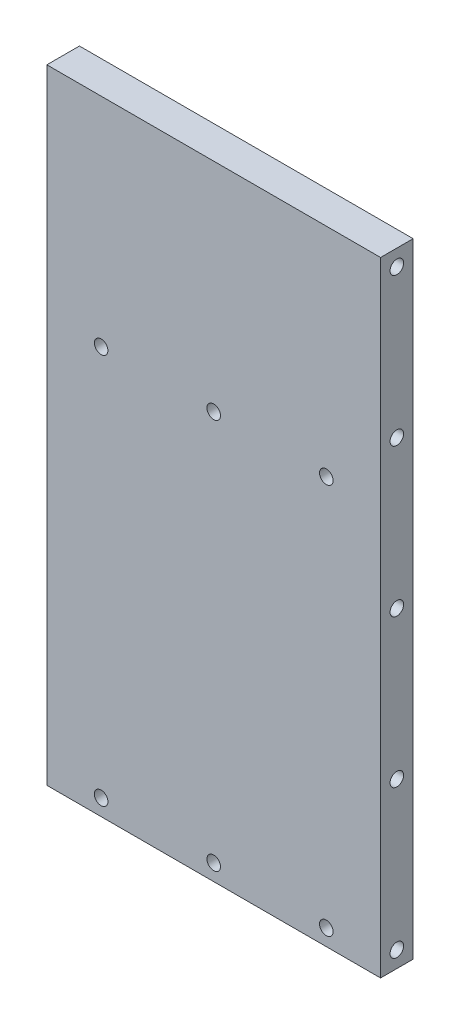
ISO-10303-21;
HEADER;
FILE_DESCRIPTION(('STEP AP214'),'2;1');
FILE_NAME('part.step','',(''),(''),'','','');
FILE_SCHEMA(('AUTOMOTIVE_DESIGN { 1 0 10303 214 1 1 1 1 }'));
ENDSEC;
DATA;
#1=APPLICATION_CONTEXT('core data for automotive mechanical design processes');
#2=APPLICATION_PROTOCOL_DEFINITION('international standard','automotive_design',2000,#1);
#3=PRODUCT_CONTEXT('',#1,'mechanical');
#4=PRODUCT('Part','Part','',(#3));
#5=PRODUCT_RELATED_PRODUCT_CATEGORY('part','',(#4));
#6=PRODUCT_DEFINITION_FORMATION('','',#4);
#7=PRODUCT_DEFINITION_CONTEXT('part definition',#1,'design');
#8=PRODUCT_DEFINITION('design','',#6,#7);
#9=PRODUCT_DEFINITION_SHAPE('','',#8);
#10=(LENGTH_UNIT() NAMED_UNIT(*) SI_UNIT(.MILLI.,.METRE.));
#11=(NAMED_UNIT(*) PLANE_ANGLE_UNIT() SI_UNIT($,.RADIAN.));
#12=(NAMED_UNIT(*) SI_UNIT($,.STERADIAN.) SOLID_ANGLE_UNIT());
#13=UNCERTAINTY_MEASURE_WITH_UNIT(LENGTH_MEASURE(1.E-05),#10,'distance_accuracy_value','');
#14=(GEOMETRIC_REPRESENTATION_CONTEXT(3) GLOBAL_UNCERTAINTY_ASSIGNED_CONTEXT((#13)) GLOBAL_UNIT_ASSIGNED_CONTEXT((#10,
#11,#12)) REPRESENTATION_CONTEXT('',''));
#15=CARTESIAN_POINT('',(0.,0.,0.));
#16=DIRECTION('',(0.,0.,1.));
#17=DIRECTION('',(1.,0.,0.));
#18=AXIS2_PLACEMENT_3D('',#15,#16,#17);
#19=CARTESIAN_POINT('',(-30.75,-54.5,0.));
#20=DIRECTION('',(-1.,0.,0.));
#21=DIRECTION('',(0.,0.,1.));
#22=AXIS2_PLACEMENT_3D('',#19,#20,#21);
#23=CYLINDRICAL_SURFACE('',#22,1.25);
#24=CARTESIAN_POINT('',(0.,-54.5,0.));
#25=DIRECTION('',(-0.707106781186547,0.,-0.707106781186547));
#26=DIRECTION('',(-0.707106781186547,0.,0.707106781186547));
#27=AXIS2_PLACEMENT_3D('',#24,#25,#26);
#28=ELLIPSE('',#27,1.76776695296637,1.25);
#29=CARTESIAN_POINT('',(0.,-53.25,0.));
#30=VERTEX_POINT('',#29);
#31=CARTESIAN_POINT('',(0.,-55.75,0.));
#32=VERTEX_POINT('',#31);
#33=EDGE_CURVE('E110',#30,#32,#28,.T.);
#34=ORIENTED_EDGE('',*,*,#33,.T.);
#35=CARTESIAN_POINT('',(0.,-54.5,0.));
#36=DIRECTION('',(-0.707106781186547,0.,0.707106781186547));
#37=DIRECTION('',(-0.707106781186547,0.,-0.707106781186547));
#38=AXIS2_PLACEMENT_3D('',#35,#36,#37);
#39=ELLIPSE('',#38,1.76776695296637,1.25);
#40=EDGE_CURVE('E107',#32,#30,#39,.T.);
#41=ORIENTED_EDGE('',*,*,#40,.T.);
#42=EDGE_LOOP('',(#34,#41));
#43=FACE_BOUND('',#42,.T.);
#44=CARTESIAN_POINT('',(20.75,-54.5,0.));
#45=DIRECTION('',(-0.707106781186547,0.,-0.707106781186547));
#46=DIRECTION('',(-0.707106781186547,0.,0.707106781186547));
#47=AXIS2_PLACEMENT_3D('',#44,#45,#46);
#48=ELLIPSE('',#47,1.76776695296637,1.25);
#49=CARTESIAN_POINT('',(20.75,-53.25,0.));
#50=VERTEX_POINT('',#49);
#51=CARTESIAN_POINT('',(20.75,-55.75,0.));
#52=VERTEX_POINT('',#51);
#53=EDGE_CURVE('E47',#50,#52,#48,.F.);
#54=ORIENTED_EDGE('',*,*,#53,.T.);
#55=CARTESIAN_POINT('',(20.75,-54.5,0.));
#56=DIRECTION('',(-0.707106781186547,0.,0.707106781186547));
#57=DIRECTION('',(-0.707106781186547,0.,-0.707106781186547));
#58=AXIS2_PLACEMENT_3D('',#55,#56,#57);
#59=ELLIPSE('',#58,1.76776695296637,1.25);
#60=EDGE_CURVE('E11',#52,#50,#59,.F.);
#61=ORIENTED_EDGE('',*,*,#60,.T.);
#62=EDGE_LOOP('',(#54,#61));
#63=FACE_BOUND('',#62,.T.);
#64=ADVANCED_FACE('F34',(#43,#63),#23,.F.);
#65=CARTESIAN_POINT('',(-20.75,-54.5,0.));
#66=DIRECTION('',(-0.707106781186547,0.,-0.707106781186547));
#67=DIRECTION('',(-0.707106781186547,0.,0.707106781186547));
#68=AXIS2_PLACEMENT_3D('',#65,#66,#67);
#69=ELLIPSE('',#68,1.76776695296637,1.25);
#70=CARTESIAN_POINT('',(-20.75,-53.25,0.));
#71=VERTEX_POINT('',#70);
#72=CARTESIAN_POINT('',(-20.75,-55.75,0.));
#73=VERTEX_POINT('',#72);
#74=EDGE_CURVE('E120',#71,#73,#69,.T.);
#75=ORIENTED_EDGE('',*,*,#74,.T.);
#76=CARTESIAN_POINT('',(-20.75,-54.5,0.));
#77=DIRECTION('',(-0.707106781186547,0.,0.707106781186547));
#78=DIRECTION('',(-0.707106781186547,0.,-0.707106781186547));
#79=AXIS2_PLACEMENT_3D('',#76,#77,#78);
#80=ELLIPSE('',#79,1.76776695296637,1.25);
#81=EDGE_CURVE('E117',#73,#71,#80,.T.);
#82=ORIENTED_EDGE('',*,*,#81,.T.);
#83=EDGE_LOOP('',(#75,#82));
#84=FACE_BOUND('',#83,.T.);
#85=CARTESIAN_POINT('',(0.,-54.5,0.));
#86=DIRECTION('',(-0.707106781186547,0.,-0.707106781186547));
#87=DIRECTION('',(-0.707106781186547,0.,0.707106781186547));
#88=AXIS2_PLACEMENT_3D('',#85,#86,#87);
#89=ELLIPSE('',#88,1.76776695296637,1.25);
#90=EDGE_CURVE('E54',#30,#32,#89,.F.);
#91=ORIENTED_EDGE('',*,*,#90,.T.);
#92=CARTESIAN_POINT('',(0.,-54.5,0.));
#93=DIRECTION('',(-0.707106781186547,0.,0.707106781186547));
#94=DIRECTION('',(-0.707106781186547,0.,-0.707106781186547));
#95=AXIS2_PLACEMENT_3D('',#92,#93,#94);
#96=ELLIPSE('',#95,1.76776695296637,1.25);
#97=EDGE_CURVE('E101',#32,#30,#96,.F.);
#98=ORIENTED_EDGE('',*,*,#97,.T.);
#99=EDGE_LOOP('',(#91,#98));
#100=FACE_BOUND('',#99,.T.);
#101=ADVANCED_FACE('F270',(#84,#100),#23,.F.);
#102=CARTESIAN_POINT('',(-30.75,-54.5,0.));
#103=DIRECTION('',(-1.,0.,0.));
#104=DIRECTION('',(0.,0.,1.));
#105=AXIS2_PLACEMENT_3D('',#102,#103,#104);
#106=CIRCLE('',#105,1.25);
#107=CARTESIAN_POINT('',(-30.75,-54.5,1.25));
#108=VERTEX_POINT('',#107);
#109=EDGE_CURVE('E182',#108,#108,#106,.T.);
#110=ORIENTED_EDGE('',*,*,#109,.T.);
#111=EDGE_LOOP('',(#110));
#112=FACE_BOUND('',#111,.T.);
#113=CARTESIAN_POINT('',(-20.75,-54.5,0.));
#114=DIRECTION('',(-0.707106781186547,0.,-0.707106781186547));
#115=DIRECTION('',(-0.707106781186547,0.,0.707106781186547));
#116=AXIS2_PLACEMENT_3D('',#113,#114,#115);
#117=ELLIPSE('',#116,1.76776695296637,1.25);
#118=EDGE_CURVE('E123',#71,#73,#117,.F.);
#119=ORIENTED_EDGE('',*,*,#118,.T.);
#120=CARTESIAN_POINT('',(-20.75,-54.5,0.));
#121=DIRECTION('',(-0.707106781186547,0.,0.707106781186547));
#122=DIRECTION('',(-0.707106781186547,0.,-0.707106781186547));
#123=AXIS2_PLACEMENT_3D('',#120,#121,#122);
#124=ELLIPSE('',#123,1.76776695296637,1.25);
#125=EDGE_CURVE('E114',#73,#71,#124,.F.);
#126=ORIENTED_EDGE('',*,*,#125,.T.);
#127=EDGE_LOOP('',(#119,#126));
#128=FACE_BOUND('',#127,.T.);
#129=ADVANCED_FACE('F276',(#112,#128),#23,.F.);
#130=CARTESIAN_POINT('',(-30.75,57.5,3.));
#131=DIRECTION('',(1.,0.,0.));
#132=DIRECTION('',(0.,0.,-1.));
#133=AXIS2_PLACEMENT_3D('',#130,#131,#132);
#134=PLANE('',#133);
#135=ORIENTED_EDGE('',*,*,#109,.F.);
#136=EDGE_LOOP('',(#135));
#137=FACE_BOUND('',#136,.T.);
#138=CARTESIAN_POINT('',(-30.75,-27.25,0.));
#139=DIRECTION('',(-1.,0.,0.));
#140=DIRECTION('',(0.,0.,1.));
#141=AXIS2_PLACEMENT_3D('',#138,#139,#140);
#142=CIRCLE('',#141,1.25);
#143=CARTESIAN_POINT('',(-30.75,-27.25,1.25));
#144=VERTEX_POINT('',#143);
#145=EDGE_CURVE('E176',#144,#144,#142,.T.);
#146=ORIENTED_EDGE('',*,*,#145,.F.);
#147=EDGE_LOOP('',(#146));
#148=FACE_BOUND('',#147,.T.);
#149=CARTESIAN_POINT('',(-30.75,0.,0.));
#150=DIRECTION('',(-1.,0.,0.));
#151=DIRECTION('',(0.,0.,1.));
#152=AXIS2_PLACEMENT_3D('',#149,#150,#151);
#153=CIRCLE('',#152,1.25);
#154=CARTESIAN_POINT('',(-30.75,0.,1.25));
#155=VERTEX_POINT('',#154);
#156=EDGE_CURVE('E170',#155,#155,#153,.T.);
#157=ORIENTED_EDGE('',*,*,#156,.F.);
#158=EDGE_LOOP('',(#157));
#159=FACE_BOUND('',#158,.T.);
#160=CARTESIAN_POINT('',(-30.75,27.25,0.));
#161=DIRECTION('',(-1.,0.,0.));
#162=DIRECTION('',(0.,0.,1.));
#163=AXIS2_PLACEMENT_3D('',#160,#161,#162);
#164=CIRCLE('',#163,1.25);
#165=CARTESIAN_POINT('',(-30.75,27.25,1.25));
#166=VERTEX_POINT('',#165);
#167=EDGE_CURVE('E164',#166,#166,#164,.T.);
#168=ORIENTED_EDGE('',*,*,#167,.F.);
#169=EDGE_LOOP('',(#168));
#170=FACE_BOUND('',#169,.T.);
#171=CARTESIAN_POINT('',(-30.75,54.5,0.));
#172=DIRECTION('',(-1.,0.,0.));
#173=DIRECTION('',(0.,0.,1.));
#174=AXIS2_PLACEMENT_3D('',#171,#172,#173);
#175=CIRCLE('',#174,1.25);
#176=CARTESIAN_POINT('',(-30.75,54.5,1.25));
#177=VERTEX_POINT('',#176);
#178=EDGE_CURVE('E158',#177,#177,#175,.T.);
#179=ORIENTED_EDGE('',*,*,#178,.F.);
#180=EDGE_LOOP('',(#179));
#181=FACE_BOUND('',#180,.T.);
#182=DIRECTION('',(0.,-1.,0.));
#183=VECTOR('',#182,1.);
#184=CARTESIAN_POINT('',(-30.75,57.5,-3.));
#185=LINE('',#184,#183);
#186=CARTESIAN_POINT('',(-30.75,57.5,-3.));
#187=VERTEX_POINT('',#186);
#188=CARTESIAN_POINT('',(-30.75,-57.5,-3.));
#189=VERTEX_POINT('',#188);
#190=EDGE_CURVE('E145',#187,#189,#185,.T.);
#191=ORIENTED_EDGE('',*,*,#190,.T.);
#192=DIRECTION('',(0.,0.,-1.));
#193=VECTOR('',#192,1.);
#194=CARTESIAN_POINT('',(-30.75,-57.5,3.));
#195=LINE('',#194,#193);
#196=CARTESIAN_POINT('',(-30.75,-57.5,3.));
#197=VERTEX_POINT('',#196);
#198=EDGE_CURVE('E125',#197,#189,#195,.T.);
#199=ORIENTED_EDGE('',*,*,#198,.F.);
#200=DIRECTION('',(0.,-1.,0.));
#201=VECTOR('',#200,1.);
#202=CARTESIAN_POINT('',(-30.75,57.5,3.));
#203=LINE('',#202,#201);
#204=CARTESIAN_POINT('',(-30.75,57.5,3.));
#205=VERTEX_POINT('',#204);
#206=EDGE_CURVE('E140',#205,#197,#203,.T.);
#207=ORIENTED_EDGE('',*,*,#206,.F.);
#208=DIRECTION('',(0.,0.,-1.));
#209=VECTOR('',#208,1.);
#210=CARTESIAN_POINT('',(-30.75,57.5,3.));
#211=LINE('',#210,#209);
#212=EDGE_CURVE('E134',#205,#187,#211,.T.);
#213=ORIENTED_EDGE('',*,*,#212,.T.);
#214=EDGE_LOOP('',(#191,#199,#207,#213));
#215=FACE_BOUND('',#214,.T.);
#216=ADVANCED_FACE('F36',(#137,#148,#159,#170,#181,#215),#134,.F.);
#217=CARTESIAN_POINT('',(-30.75,-57.5,3.));
#218=DIRECTION('',(0.,1.,0.));
#219=DIRECTION('',(0.,0.,1.));
#220=AXIS2_PLACEMENT_3D('',#217,#218,#219);
#221=PLANE('',#220);
#222=DIRECTION('',(1.,0.,0.));
#223=VECTOR('',#222,1.);
#224=CARTESIAN_POINT('',(-30.75,-57.5,-3.));
#225=LINE('',#224,#223);
#226=CARTESIAN_POINT('',(30.75,-57.5,-3.));
#227=VERTEX_POINT('',#226);
#228=EDGE_CURVE('E143',#189,#227,#225,.T.);
#229=ORIENTED_EDGE('',*,*,#228,.T.);
#230=DIRECTION('',(0.,0.,-1.));
#231=VECTOR('',#230,1.);
#232=CARTESIAN_POINT('',(30.75,-57.5,3.));
#233=LINE('',#232,#231);
#234=CARTESIAN_POINT('',(30.75,-57.5,3.));
#235=VERTEX_POINT('',#234);
#236=EDGE_CURVE('E128',#235,#227,#233,.T.);
#237=ORIENTED_EDGE('',*,*,#236,.F.);
#238=DIRECTION('',(1.,0.,0.));
#239=VECTOR('',#238,1.);
#240=CARTESIAN_POINT('',(-30.75,-57.5,3.));
#241=LINE('',#240,#239);
#242=EDGE_CURVE('E152',#197,#235,#241,.T.);
#243=ORIENTED_EDGE('',*,*,#242,.F.);
#244=ORIENTED_EDGE('',*,*,#198,.T.);
#245=EDGE_LOOP('',(#229,#237,#243,#244));
#246=FACE_BOUND('',#245,.T.);
#247=ADVANCED_FACE('F248',(#246),#221,.F.);
#248=CARTESIAN_POINT('',(30.75,57.5,3.));
#249=DIRECTION('',(-1.,0.,0.));
#250=DIRECTION('',(0.,0.,1.));
#251=AXIS2_PLACEMENT_3D('',#248,#249,#250);
#252=PLANE('',#251);
#253=CARTESIAN_POINT('',(30.75,-54.5,0.));
#254=DIRECTION('',(-1.,0.,0.));
#255=DIRECTION('',(0.,0.,1.));
#256=AXIS2_PLACEMENT_3D('',#253,#254,#255);
#257=CIRCLE('',#256,1.24999999999999);
#258=CARTESIAN_POINT('',(30.75,-54.5,1.24999999999999));
#259=VERTEX_POINT('',#258);
#260=EDGE_CURVE('E179',#259,#259,#257,.T.);
#261=ORIENTED_EDGE('',*,*,#260,.T.);
#262=EDGE_LOOP('',(#261));
#263=FACE_BOUND('',#262,.T.);
#264=CARTESIAN_POINT('',(30.75,-27.25,0.));
#265=DIRECTION('',(-1.,0.,0.));
#266=DIRECTION('',(0.,0.,1.));
#267=AXIS2_PLACEMENT_3D('',#264,#265,#266);
#268=CIRCLE('',#267,1.24999999999999);
#269=CARTESIAN_POINT('',(30.75,-27.25,1.24999999999999));
#270=VERTEX_POINT('',#269);
#271=EDGE_CURVE('E173',#270,#270,#268,.T.);
#272=ORIENTED_EDGE('',*,*,#271,.T.);
#273=EDGE_LOOP('',(#272));
#274=FACE_BOUND('',#273,.T.);
#275=CARTESIAN_POINT('',(30.75,0.,0.));
#276=DIRECTION('',(-1.,0.,0.));
#277=DIRECTION('',(0.,0.,1.));
#278=AXIS2_PLACEMENT_3D('',#275,#276,#277);
#279=CIRCLE('',#278,1.24999999999999);
#280=CARTESIAN_POINT('',(30.75,0.,1.24999999999999));
#281=VERTEX_POINT('',#280);
#282=EDGE_CURVE('E167',#281,#281,#279,.T.);
#283=ORIENTED_EDGE('',*,*,#282,.T.);
#284=EDGE_LOOP('',(#283));
#285=FACE_BOUND('',#284,.T.);
#286=CARTESIAN_POINT('',(30.75,27.25,0.));
#287=DIRECTION('',(-1.,0.,0.));
#288=DIRECTION('',(0.,0.,1.));
#289=AXIS2_PLACEMENT_3D('',#286,#287,#288);
#290=CIRCLE('',#289,1.24999999999999);
#291=CARTESIAN_POINT('',(30.75,27.25,1.24999999999999));
#292=VERTEX_POINT('',#291);
#293=EDGE_CURVE('E161',#292,#292,#290,.T.);
#294=ORIENTED_EDGE('',*,*,#293,.T.);
#295=EDGE_LOOP('',(#294));
#296=FACE_BOUND('',#295,.T.);
#297=CARTESIAN_POINT('',(30.75,54.5,0.));
#298=DIRECTION('',(-1.,0.,0.));
#299=DIRECTION('',(0.,0.,1.));
#300=AXIS2_PLACEMENT_3D('',#297,#298,#299);
#301=CIRCLE('',#300,1.24999999999999);
#302=CARTESIAN_POINT('',(30.75,54.5,1.24999999999999));
#303=VERTEX_POINT('',#302);
#304=EDGE_CURVE('E148',#303,#303,#301,.T.);
#305=ORIENTED_EDGE('',*,*,#304,.T.);
#306=EDGE_LOOP('',(#305));
#307=FACE_BOUND('',#306,.T.);
#308=DIRECTION('',(0.,1.,0.));
#309=VECTOR('',#308,1.);
#310=CARTESIAN_POINT('',(30.75,57.5,-3.));
#311=LINE('',#310,#309);
#312=CARTESIAN_POINT('',(30.75,57.5,-3.));
#313=VERTEX_POINT('',#312);
#314=EDGE_CURVE('E141',#227,#313,#311,.T.);
#315=ORIENTED_EDGE('',*,*,#314,.T.);
#316=DIRECTION('',(0.,0.,-1.));
#317=VECTOR('',#316,1.);
#318=CARTESIAN_POINT('',(30.75,57.5,3.));
#319=LINE('',#318,#317);
#320=CARTESIAN_POINT('',(30.75,57.5,3.));
#321=VERTEX_POINT('',#320);
#322=EDGE_CURVE('E131',#321,#313,#319,.T.);
#323=ORIENTED_EDGE('',*,*,#322,.F.);
#324=DIRECTION('',(0.,1.,0.));
#325=VECTOR('',#324,1.);
#326=CARTESIAN_POINT('',(30.75,57.5,3.));
#327=LINE('',#326,#325);
#328=EDGE_CURVE('E150',#235,#321,#327,.T.);
#329=ORIENTED_EDGE('',*,*,#328,.F.);
#330=ORIENTED_EDGE('',*,*,#236,.T.);
#331=EDGE_LOOP('',(#315,#323,#329,#330));
#332=FACE_BOUND('',#331,.T.);
#333=ADVANCED_FACE('F253',(#263,#274,#285,#296,#307,#332),#252,.F.);
#334=CARTESIAN_POINT('',(-30.75,57.5,3.));
#335=DIRECTION('',(0.,-1.,0.));
#336=DIRECTION('',(0.,0.,-1.));
#337=AXIS2_PLACEMENT_3D('',#334,#335,#336);
#338=PLANE('',#337);
#339=DIRECTION('',(-1.,0.,0.));
#340=VECTOR('',#339,1.);
#341=CARTESIAN_POINT('',(-30.75,57.5,-3.));
#342=LINE('',#341,#340);
#343=EDGE_CURVE('E138',#313,#187,#342,.T.);
#344=ORIENTED_EDGE('',*,*,#343,.T.);
#345=ORIENTED_EDGE('',*,*,#212,.F.);
#346=DIRECTION('',(-1.,0.,0.));
#347=VECTOR('',#346,1.);
#348=CARTESIAN_POINT('',(-30.75,57.5,3.));
#349=LINE('',#348,#347);
#350=EDGE_CURVE('E137',#321,#205,#349,.T.);
#351=ORIENTED_EDGE('',*,*,#350,.F.);
#352=ORIENTED_EDGE('',*,*,#322,.T.);
#353=EDGE_LOOP('',(#344,#345,#351,#352));
#354=FACE_BOUND('',#353,.T.);
#355=ADVANCED_FACE('F228',(#354),#338,.F.);
#356=CARTESIAN_POINT('',(0.,0.,3.));
#357=DIRECTION('',(0.,0.,1.));
#358=DIRECTION('',(1.,0.,0.));
#359=AXIS2_PLACEMENT_3D('',#356,#357,#358);
#360=PLANE('',#359);
#361=CARTESIAN_POINT('',(-20.75,17.5,3.));
#362=DIRECTION('',(0.,0.,1.));
#363=DIRECTION('',(1.,0.,0.));
#364=AXIS2_PLACEMENT_3D('',#361,#362,#363);
#365=CIRCLE('',#364,1.25);
#366=CARTESIAN_POINT('',(-19.5,17.5,3.));
#367=VERTEX_POINT('',#366);
#368=EDGE_CURVE('E218',#367,#367,#365,.T.);
#369=ORIENTED_EDGE('',*,*,#368,.F.);
#370=EDGE_LOOP('',(#369));
#371=FACE_BOUND('',#370,.T.);
#372=CARTESIAN_POINT('',(0.,17.5,3.));
#373=DIRECTION('',(0.,0.,1.));
#374=DIRECTION('',(1.,0.,0.));
#375=AXIS2_PLACEMENT_3D('',#372,#373,#374);
#376=CIRCLE('',#375,1.25);
#377=CARTESIAN_POINT('',(1.25,17.5,3.));
#378=VERTEX_POINT('',#377);
#379=EDGE_CURVE('E212',#378,#378,#376,.T.);
#380=ORIENTED_EDGE('',*,*,#379,.F.);
#381=EDGE_LOOP('',(#380));
#382=FACE_BOUND('',#381,.T.);
#383=CARTESIAN_POINT('',(20.75,17.5,3.));
#384=DIRECTION('',(0.,0.,1.));
#385=DIRECTION('',(1.,0.,0.));
#386=AXIS2_PLACEMENT_3D('',#383,#384,#385);
#387=CIRCLE('',#386,1.25);
#388=CARTESIAN_POINT('',(22.,17.5,3.));
#389=VERTEX_POINT('',#388);
#390=EDGE_CURVE('E206',#389,#389,#387,.T.);
#391=ORIENTED_EDGE('',*,*,#390,.F.);
#392=EDGE_LOOP('',(#391));
#393=FACE_BOUND('',#392,.T.);
#394=CARTESIAN_POINT('',(20.75,-54.5,3.));
#395=DIRECTION('',(0.,0.,1.));
#396=DIRECTION('',(1.,0.,0.));
#397=AXIS2_PLACEMENT_3D('',#394,#395,#396);
#398=CIRCLE('',#397,1.25);
#399=CARTESIAN_POINT('',(22.,-54.5,3.));
#400=VERTEX_POINT('',#399);
#401=EDGE_CURVE('E200',#400,#400,#398,.T.);
#402=ORIENTED_EDGE('',*,*,#401,.F.);
#403=EDGE_LOOP('',(#402));
#404=FACE_BOUND('',#403,.T.);
#405=CARTESIAN_POINT('',(0.,-54.5,3.));
#406=DIRECTION('',(0.,0.,1.));
#407=DIRECTION('',(1.,0.,0.));
#408=AXIS2_PLACEMENT_3D('',#405,#406,#407);
#409=CIRCLE('',#408,1.25);
#410=CARTESIAN_POINT('',(1.25000000000001,-54.5,3.));
#411=VERTEX_POINT('',#410);
#412=EDGE_CURVE('E194',#411,#411,#409,.T.);
#413=ORIENTED_EDGE('',*,*,#412,.F.);
#414=EDGE_LOOP('',(#413));
#415=FACE_BOUND('',#414,.T.);
#416=CARTESIAN_POINT('',(-20.75,-54.5,3.));
#417=DIRECTION('',(0.,0.,1.));
#418=DIRECTION('',(1.,0.,0.));
#419=AXIS2_PLACEMENT_3D('',#416,#417,#418);
#420=CIRCLE('',#419,1.25);
#421=CARTESIAN_POINT('',(-19.5,-54.5,3.));
#422=VERTEX_POINT('',#421);
#423=EDGE_CURVE('E188',#422,#422,#420,.T.);
#424=ORIENTED_EDGE('',*,*,#423,.F.);
#425=EDGE_LOOP('',(#424));
#426=FACE_BOUND('',#425,.T.);
#427=ORIENTED_EDGE('',*,*,#206,.T.);
#428=ORIENTED_EDGE('',*,*,#242,.T.);
#429=ORIENTED_EDGE('',*,*,#328,.T.);
#430=ORIENTED_EDGE('',*,*,#350,.T.);
#431=EDGE_LOOP('',(#427,#428,#429,#430));
#432=FACE_BOUND('',#431,.T.);
#433=ADVANCED_FACE('F224',(#371,#382,#393,#404,#415,#426,#432),#360,.T.);
#434=CARTESIAN_POINT('',(0.,0.,-3.));
#435=DIRECTION('',(0.,0.,1.));
#436=DIRECTION('',(1.,0.,0.));
#437=AXIS2_PLACEMENT_3D('',#434,#435,#436);
#438=PLANE('',#437);
#439=CARTESIAN_POINT('',(-20.75,17.5,-3.));
#440=DIRECTION('',(0.,0.,1.));
#441=DIRECTION('',(1.,0.,0.));
#442=AXIS2_PLACEMENT_3D('',#439,#440,#441);
#443=CIRCLE('',#442,1.25);
#444=CARTESIAN_POINT('',(-19.5,17.5,-3.));
#445=VERTEX_POINT('',#444);
#446=EDGE_CURVE('E215',#445,#445,#443,.T.);
#447=ORIENTED_EDGE('',*,*,#446,.T.);
#448=EDGE_LOOP('',(#447));
#449=FACE_BOUND('',#448,.T.);
#450=CARTESIAN_POINT('',(0.,17.5,-3.));
#451=DIRECTION('',(0.,0.,1.));
#452=DIRECTION('',(1.,0.,0.));
#453=AXIS2_PLACEMENT_3D('',#450,#451,#452);
#454=CIRCLE('',#453,1.25);
#455=CARTESIAN_POINT('',(1.25,17.5,-3.));
#456=VERTEX_POINT('',#455);
#457=EDGE_CURVE('E209',#456,#456,#454,.T.);
#458=ORIENTED_EDGE('',*,*,#457,.T.);
#459=EDGE_LOOP('',(#458));
#460=FACE_BOUND('',#459,.T.);
#461=CARTESIAN_POINT('',(20.75,17.5,-3.));
#462=DIRECTION('',(0.,0.,1.));
#463=DIRECTION('',(1.,0.,0.));
#464=AXIS2_PLACEMENT_3D('',#461,#462,#463);
#465=CIRCLE('',#464,1.25);
#466=CARTESIAN_POINT('',(22.,17.5,-3.));
#467=VERTEX_POINT('',#466);
#468=EDGE_CURVE('E203',#467,#467,#465,.T.);
#469=ORIENTED_EDGE('',*,*,#468,.T.);
#470=EDGE_LOOP('',(#469));
#471=FACE_BOUND('',#470,.T.);
#472=CARTESIAN_POINT('',(20.75,-54.5,-3.));
#473=DIRECTION('',(0.,0.,1.));
#474=DIRECTION('',(1.,0.,0.));
#475=AXIS2_PLACEMENT_3D('',#472,#473,#474);
#476=CIRCLE('',#475,1.25);
#477=CARTESIAN_POINT('',(22.,-54.5,-3.));
#478=VERTEX_POINT('',#477);
#479=EDGE_CURVE('E197',#478,#478,#476,.T.);
#480=ORIENTED_EDGE('',*,*,#479,.T.);
#481=EDGE_LOOP('',(#480));
#482=FACE_BOUND('',#481,.T.);
#483=CARTESIAN_POINT('',(0.,-54.5,-3.));
#484=DIRECTION('',(0.,0.,1.));
#485=DIRECTION('',(1.,0.,0.));
#486=AXIS2_PLACEMENT_3D('',#483,#484,#485);
#487=CIRCLE('',#486,1.25);
#488=CARTESIAN_POINT('',(1.25000000000001,-54.5,-3.));
#489=VERTEX_POINT('',#488);
#490=EDGE_CURVE('E191',#489,#489,#487,.T.);
#491=ORIENTED_EDGE('',*,*,#490,.T.);
#492=EDGE_LOOP('',(#491));
#493=FACE_BOUND('',#492,.T.);
#494=CARTESIAN_POINT('',(-20.75,-54.5,-3.));
#495=DIRECTION('',(0.,0.,1.));
#496=DIRECTION('',(1.,0.,0.));
#497=AXIS2_PLACEMENT_3D('',#494,#495,#496);
#498=CIRCLE('',#497,1.25);
#499=CARTESIAN_POINT('',(-19.5,-54.5,-3.));
#500=VERTEX_POINT('',#499);
#501=EDGE_CURVE('E185',#500,#500,#498,.T.);
#502=ORIENTED_EDGE('',*,*,#501,.T.);
#503=EDGE_LOOP('',(#502));
#504=FACE_BOUND('',#503,.T.);
#505=ORIENTED_EDGE('',*,*,#190,.F.);
#506=ORIENTED_EDGE('',*,*,#343,.F.);
#507=ORIENTED_EDGE('',*,*,#314,.F.);
#508=ORIENTED_EDGE('',*,*,#228,.F.);
#509=EDGE_LOOP('',(#505,#506,#507,#508));
#510=FACE_BOUND('',#509,.T.);
#511=ADVANCED_FACE('F227',(#449,#460,#471,#482,#493,#504,#510),#438,.F.);
#512=CARTESIAN_POINT('',(-30.75,54.5,0.));
#513=DIRECTION('',(-1.,0.,0.));
#514=DIRECTION('',(0.,0.,1.));
#515=AXIS2_PLACEMENT_3D('',#512,#513,#514);
#516=CYLINDRICAL_SURFACE('',#515,1.25);
#517=ORIENTED_EDGE('',*,*,#304,.F.);
#518=EDGE_LOOP('',(#517));
#519=FACE_BOUND('',#518,.T.);
#520=ORIENTED_EDGE('',*,*,#178,.T.);
#521=EDGE_LOOP('',(#520));
#522=FACE_BOUND('',#521,.T.);
#523=ADVANCED_FACE('F258',(#519,#522),#516,.F.);
#524=CARTESIAN_POINT('',(-30.75,27.25,0.));
#525=DIRECTION('',(-1.,0.,0.));
#526=DIRECTION('',(0.,0.,1.));
#527=AXIS2_PLACEMENT_3D('',#524,#525,#526);
#528=CYLINDRICAL_SURFACE('',#527,1.24999999999999);
#529=ORIENTED_EDGE('',*,*,#293,.F.);
#530=EDGE_LOOP('',(#529));
#531=FACE_BOUND('',#530,.T.);
#532=ORIENTED_EDGE('',*,*,#167,.T.);
#533=EDGE_LOOP('',(#532));
#534=FACE_BOUND('',#533,.T.);
#535=ADVANCED_FACE('F264',(#531,#534),#528,.F.);
#536=CARTESIAN_POINT('',(-30.75,0.,0.));
#537=DIRECTION('',(-1.,0.,0.));
#538=DIRECTION('',(0.,0.,1.));
#539=AXIS2_PLACEMENT_3D('',#536,#537,#538);
#540=CYLINDRICAL_SURFACE('',#539,1.25);
#541=ORIENTED_EDGE('',*,*,#282,.F.);
#542=EDGE_LOOP('',(#541));
#543=FACE_BOUND('',#542,.T.);
#544=ORIENTED_EDGE('',*,*,#156,.T.);
#545=EDGE_LOOP('',(#544));
#546=FACE_BOUND('',#545,.T.);
#547=ADVANCED_FACE('F289',(#543,#546),#540,.F.);
#548=CARTESIAN_POINT('',(-30.75,-27.25,0.));
#549=DIRECTION('',(-1.,0.,0.));
#550=DIRECTION('',(0.,0.,1.));
#551=AXIS2_PLACEMENT_3D('',#548,#549,#550);
#552=CYLINDRICAL_SURFACE('',#551,1.25);
#553=ORIENTED_EDGE('',*,*,#271,.F.);
#554=EDGE_LOOP('',(#553));
#555=FACE_BOUND('',#554,.T.);
#556=ORIENTED_EDGE('',*,*,#145,.T.);
#557=EDGE_LOOP('',(#556));
#558=FACE_BOUND('',#557,.T.);
#559=ADVANCED_FACE('F282',(#555,#558),#552,.F.);
#560=CARTESIAN_POINT('',(20.75,-54.5,0.));
#561=DIRECTION('',(-0.707106781186547,0.,-0.707106781186547));
#562=DIRECTION('',(-0.707106781186547,0.,0.707106781186547));
#563=AXIS2_PLACEMENT_3D('',#560,#561,#562);
#564=ELLIPSE('',#563,1.76776695296637,1.25);
#565=EDGE_CURVE('E94',#50,#52,#564,.T.);
#566=ORIENTED_EDGE('',*,*,#565,.T.);
#567=CARTESIAN_POINT('',(20.75,-54.5,0.));
#568=DIRECTION('',(-0.707106781186547,0.,0.707106781186547));
#569=DIRECTION('',(-0.707106781186547,0.,-0.707106781186547));
#570=AXIS2_PLACEMENT_3D('',#567,#568,#569);
#571=ELLIPSE('',#570,1.76776695296637,1.25);
#572=EDGE_CURVE('E42',#52,#50,#571,.T.);
#573=ORIENTED_EDGE('',*,*,#572,.T.);
#574=EDGE_LOOP('',(#566,#573));
#575=FACE_BOUND('',#574,.T.);
#576=ORIENTED_EDGE('',*,*,#260,.F.);
#577=EDGE_LOOP('',(#576));
#578=FACE_BOUND('',#577,.T.);
#579=ADVANCED_FACE('F103',(#575,#578),#23,.F.);
#580=CARTESIAN_POINT('',(-20.75,-54.5,3.));
#581=DIRECTION('',(0.,0.,1.));
#582=DIRECTION('',(1.,0.,0.));
#583=AXIS2_PLACEMENT_3D('',#580,#581,#582);
#584=CYLINDRICAL_SURFACE('',#583,1.25);
#585=ORIENTED_EDGE('',*,*,#423,.T.);
#586=EDGE_LOOP('',(#585));
#587=FACE_BOUND('',#586,.T.);
#588=ORIENTED_EDGE('',*,*,#118,.F.);
#589=ORIENTED_EDGE('',*,*,#81,.F.);
#590=EDGE_LOOP('',(#588,#589));
#591=FACE_BOUND('',#590,.T.);
#592=ADVANCED_FACE('F281',(#587,#591),#584,.F.);
#593=ORIENTED_EDGE('',*,*,#501,.F.);
#594=EDGE_LOOP('',(#593));
#595=FACE_BOUND('',#594,.T.);
#596=ORIENTED_EDGE('',*,*,#74,.F.);
#597=ORIENTED_EDGE('',*,*,#125,.F.);
#598=EDGE_LOOP('',(#596,#597));
#599=FACE_BOUND('',#598,.T.);
#600=ADVANCED_FACE('F287',(#595,#599),#584,.F.);
#601=CARTESIAN_POINT('',(0.,-54.5,3.));
#602=DIRECTION('',(0.,0.,1.));
#603=DIRECTION('',(1.,0.,0.));
#604=AXIS2_PLACEMENT_3D('',#601,#602,#603);
#605=CYLINDRICAL_SURFACE('',#604,1.25);
#606=ORIENTED_EDGE('',*,*,#412,.T.);
#607=EDGE_LOOP('',(#606));
#608=FACE_BOUND('',#607,.T.);
#609=ORIENTED_EDGE('',*,*,#90,.F.);
#610=ORIENTED_EDGE('',*,*,#40,.F.);
#611=EDGE_LOOP('',(#609,#610));
#612=FACE_BOUND('',#611,.T.);
#613=ADVANCED_FACE('F305',(#608,#612),#605,.F.);
#614=ORIENTED_EDGE('',*,*,#490,.F.);
#615=EDGE_LOOP('',(#614));
#616=FACE_BOUND('',#615,.T.);
#617=ORIENTED_EDGE('',*,*,#33,.F.);
#618=ORIENTED_EDGE('',*,*,#97,.F.);
#619=EDGE_LOOP('',(#617,#618));
#620=FACE_BOUND('',#619,.T.);
#621=ADVANCED_FACE('F310',(#616,#620),#605,.F.);
#622=CARTESIAN_POINT('',(20.75,-54.5,3.));
#623=DIRECTION('',(0.,0.,1.));
#624=DIRECTION('',(1.,0.,0.));
#625=AXIS2_PLACEMENT_3D('',#622,#623,#624);
#626=CYLINDRICAL_SURFACE('',#625,1.25);
#627=ORIENTED_EDGE('',*,*,#401,.T.);
#628=EDGE_LOOP('',(#627));
#629=FACE_BOUND('',#628,.T.);
#630=ORIENTED_EDGE('',*,*,#53,.F.);
#631=ORIENTED_EDGE('',*,*,#572,.F.);
#632=EDGE_LOOP('',(#630,#631));
#633=FACE_BOUND('',#632,.T.);
#634=ADVANCED_FACE('F100',(#629,#633),#626,.F.);
#635=ORIENTED_EDGE('',*,*,#479,.F.);
#636=EDGE_LOOP('',(#635));
#637=FACE_BOUND('',#636,.T.);
#638=ORIENTED_EDGE('',*,*,#565,.F.);
#639=ORIENTED_EDGE('',*,*,#60,.F.);
#640=EDGE_LOOP('',(#638,#639));
#641=FACE_BOUND('',#640,.T.);
#642=ADVANCED_FACE('F95',(#637,#641),#626,.F.);
#643=CARTESIAN_POINT('',(20.75,17.5,3.));
#644=DIRECTION('',(0.,0.,1.));
#645=DIRECTION('',(1.,0.,0.));
#646=AXIS2_PLACEMENT_3D('',#643,#644,#645);
#647=CYLINDRICAL_SURFACE('',#646,1.25);
#648=ORIENTED_EDGE('',*,*,#468,.F.);
#649=EDGE_LOOP('',(#648));
#650=FACE_BOUND('',#649,.T.);
#651=ORIENTED_EDGE('',*,*,#390,.T.);
#652=EDGE_LOOP('',(#651));
#653=FACE_BOUND('',#652,.T.);
#654=ADVANCED_FACE('F319',(#650,#653),#647,.F.);
#655=CARTESIAN_POINT('',(0.,17.5,3.));
#656=DIRECTION('',(0.,0.,1.));
#657=DIRECTION('',(1.,0.,0.));
#658=AXIS2_PLACEMENT_3D('',#655,#656,#657);
#659=CYLINDRICAL_SURFACE('',#658,1.25);
#660=ORIENTED_EDGE('',*,*,#457,.F.);
#661=EDGE_LOOP('',(#660));
#662=FACE_BOUND('',#661,.T.);
#663=ORIENTED_EDGE('',*,*,#379,.T.);
#664=EDGE_LOOP('',(#663));
#665=FACE_BOUND('',#664,.T.);
#666=ADVANCED_FACE('F323',(#662,#665),#659,.F.);
#667=CARTESIAN_POINT('',(-20.75,17.5,3.));
#668=DIRECTION('',(0.,0.,1.));
#669=DIRECTION('',(1.,0.,0.));
#670=AXIS2_PLACEMENT_3D('',#667,#668,#669);
#671=CYLINDRICAL_SURFACE('',#670,1.25);
#672=ORIENTED_EDGE('',*,*,#446,.F.);
#673=EDGE_LOOP('',(#672));
#674=FACE_BOUND('',#673,.T.);
#675=ORIENTED_EDGE('',*,*,#368,.T.);
#676=EDGE_LOOP('',(#675));
#677=FACE_BOUND('',#676,.T.);
#678=ADVANCED_FACE('F222',(#674,#677),#671,.F.);
#679=CLOSED_SHELL('',(#64,#101,#129,#216,#247,#333,#355,#433,#511,#523,#535,#547,#559,#579,#592,
#600,#613,#621,#634,#642,#654,#666,#678));
#680=MANIFOLD_SOLID_BREP('B2',#679);
#681=ADVANCED_BREP_SHAPE_REPRESENTATION('',(#18,#680),#14);
#682=SHAPE_DEFINITION_REPRESENTATION(#9,#681);
ENDSEC;
END-ISO-10303-21;
